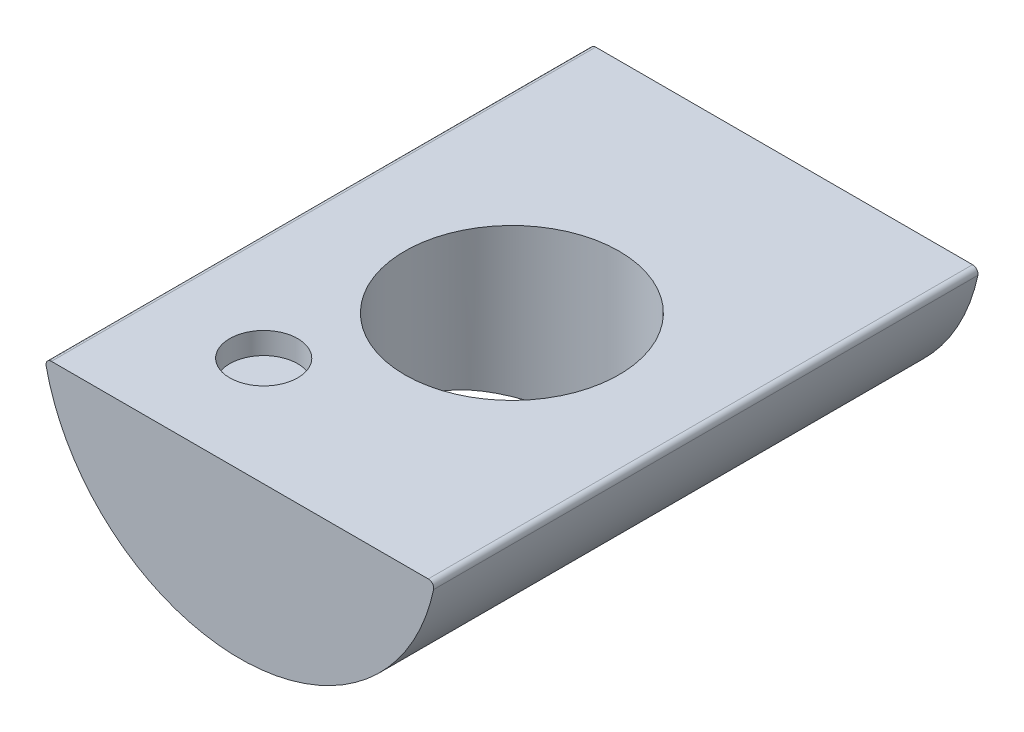
ISO-10303-21;
HEADER;
FILE_DESCRIPTION(('STEP AP214'),'2;1');
FILE_NAME('part.step','',(''),(''),'','','');
FILE_SCHEMA(('AUTOMOTIVE_DESIGN { 1 0 10303 214 1 1 1 1 }'));
ENDSEC;
DATA;
#1=APPLICATION_CONTEXT('core data for automotive mechanical design processes');
#2=APPLICATION_PROTOCOL_DEFINITION('international standard','automotive_design',2000,#1);
#3=PRODUCT_CONTEXT('',#1,'mechanical');
#4=PRODUCT('Part','Part','',(#3));
#5=PRODUCT_RELATED_PRODUCT_CATEGORY('part','',(#4));
#6=PRODUCT_DEFINITION_FORMATION('','',#4);
#7=PRODUCT_DEFINITION_CONTEXT('part definition',#1,'design');
#8=PRODUCT_DEFINITION('design','',#6,#7);
#9=PRODUCT_DEFINITION_SHAPE('','',#8);
#10=(LENGTH_UNIT() NAMED_UNIT(*) SI_UNIT(.MILLI.,.METRE.));
#11=(NAMED_UNIT(*) PLANE_ANGLE_UNIT() SI_UNIT($,.RADIAN.));
#12=(NAMED_UNIT(*) SI_UNIT($,.STERADIAN.) SOLID_ANGLE_UNIT());
#13=UNCERTAINTY_MEASURE_WITH_UNIT(LENGTH_MEASURE(1.E-05),#10,'distance_accuracy_value','');
#14=(GEOMETRIC_REPRESENTATION_CONTEXT(3) GLOBAL_UNCERTAINTY_ASSIGNED_CONTEXT((#13)) GLOBAL_UNIT_ASSIGNED_CONTEXT((#10,
#11,#12)) REPRESENTATION_CONTEXT('',''));
#15=CARTESIAN_POINT('',(0.,0.,0.));
#16=DIRECTION('',(0.,0.,1.));
#17=DIRECTION('',(1.,0.,0.));
#18=AXIS2_PLACEMENT_3D('',#15,#16,#17);
#19=CARTESIAN_POINT('',(-12.6225970548717,28.9487457233982,-4.81014496005846));
#20=DIRECTION('',(0.,0.,-1.));
#21=DIRECTION('',(-1.,0.,0.));
#22=AXIS2_PLACEMENT_3D('',#19,#20,#21);
#23=CYLINDRICAL_SURFACE('',#22,4.6228);
#24=CARTESIAN_POINT('',(-12.6248721884304,24.3259462832573,-8.66014496005847));
#25=CARTESIAN_POINT('',(-12.4947833335061,24.3258910699192,-8.66015506258581));
#26=CARTESIAN_POINT('',(-12.3645705771466,24.3313664831415,-8.67035875268396));
#27=CARTESIAN_POINT('',(-12.1080742805041,24.3528580509267,-8.71068866632045));
#28=CARTESIAN_POINT('',(-11.9817967768037,24.3688896379145,-8.74084405823269));
#29=CARTESIAN_POINT('',(-11.7372503259711,24.409830242305,-8.8195124474552));
#30=CARTESIAN_POINT('',(-11.6189510357819,24.4347030693686,-8.86795065597358));
#31=CARTESIAN_POINT('',(-11.3923804420316,24.4911119954172,-8.98137653848952));
#32=CARTESIAN_POINT('',(-11.2841093673319,24.5226482464192,-9.04636459005685));
#33=CARTESIAN_POINT('',(-11.0724886317545,24.5920654983948,-9.19596314164286));
#34=CARTESIAN_POINT('',(-10.9699584489724,24.6302304348879,-9.28159869626917));
#35=CARTESIAN_POINT('',(-10.779939603171,24.7078203252628,-9.46782638069024));
#36=CARTESIAN_POINT('',(-10.6924644748606,24.7472463755391,-9.56843181870825));
#37=CARTESIAN_POINT('',(-10.5267104926649,24.8272433993524,-9.79302877983199));
#38=CARTESIAN_POINT('',(-10.4500799810934,24.8675709444675,-9.91833153615035));
#39=CARTESIAN_POINT('',(-10.3192659632523,24.9399327099672,-10.182492226038));
#40=CARTESIAN_POINT('',(-10.2650650026226,24.971973371778,-10.3213395150658));
#41=CARTESIAN_POINT('',(-10.2039846131104,25.009062953147,-10.5322551124396));
#42=CARTESIAN_POINT('',(-10.1872560983136,25.0194129577074,-10.6006643838788));
#43=CARTESIAN_POINT('',(-10.1595835514487,25.0366983207679,-10.739051597819));
#44=CARTESIAN_POINT('',(-10.1486361807957,25.0436356499142,-10.8090286105614));
#45=CARTESIAN_POINT('',(-10.1327242028725,25.0537613040664,-10.9498697338461));
#46=CARTESIAN_POINT('',(-10.1277543402649,25.0569529221866,-11.0207330097243));
#47=CARTESIAN_POINT('',(-10.1238641924337,25.0594510476663,-11.1626699349994));
#48=CARTESIAN_POINT('',(-10.1249431346683,25.0587580511612,-11.2337435563725));
#49=CARTESIAN_POINT('',(-10.1360580874041,25.051629501079,-11.4255523821007));
#50=CARTESIAN_POINT('',(-10.1518868982212,25.0414806985369,-11.5458759320985));
#51=CARTESIAN_POINT('',(-10.2003727243255,25.0112474332418,-11.7817089395269));
#52=CARTESIAN_POINT('',(-10.2330368743097,24.9911587581859,-11.8972163334541));
#53=CARTESIAN_POINT('',(-10.3147177494191,24.9429676875543,-12.1234556720692));
#54=CARTESIAN_POINT('',(-10.364078281137,24.9146987802613,-12.2340267442154));
#55=CARTESIAN_POINT('',(-10.4774659879836,24.8532793084971,-12.4458758194738));
#56=CARTESIAN_POINT('',(-10.5414995998171,24.8201266039153,-12.5471497167641));
#57=CARTESIAN_POINT('',(-10.6936816093927,24.7466353626982,-12.7536782685087));
#58=CARTESIAN_POINT('',(-10.7840133048761,24.7059688734669,-12.857213676463));
#59=CARTESIAN_POINT('',(-10.9807518072106,24.6260258930419,-13.0484520310651));
#60=CARTESIAN_POINT('',(-11.087168834345,24.5867503053222,-13.1361448333278));
#61=CARTESIAN_POINT('',(-11.321381156863,24.5110466892464,-13.2984721090126));
#62=CARTESIAN_POINT('',(-11.4500976791397,24.4749508008773,-13.3719455732565));
#63=CARTESIAN_POINT('',(-11.7204915537697,24.4127052377438,-13.4955538186259));
#64=CARTESIAN_POINT('',(-11.8621569163935,24.3865464753404,-13.545709933232));
#65=CARTESIAN_POINT('',(-12.1405801131125,24.3491984927634,-13.6166003322927));
#66=CARTESIAN_POINT('',(-12.2766036298499,24.336859877629,-13.6396041894614));
#67=CARTESIAN_POINT('',(-12.5511089981064,24.3244619830764,-13.6628428176674));
#68=CARTESIAN_POINT('',(-12.6895893168498,24.3243952993073,-13.6630913182538));
#69=CARTESIAN_POINT('',(-12.9512205883297,24.3359556709932,-13.6418980287714));
#70=CARTESIAN_POINT('',(-13.0745926595186,24.3464882370768,-13.6224852725976));
#71=CARTESIAN_POINT('',(-13.3160176245164,24.3766290539829,-13.5659074589665));
#72=CARTESIAN_POINT('',(-13.4340699673564,24.3962382425195,-13.5287405673009));
#73=CARTESIAN_POINT('',(-13.6648810849621,24.4433995366948,-13.4370249909311));
#74=CARTESIAN_POINT('',(-13.7774441032006,24.4711314323756,-13.382079537852));
#75=CARTESIAN_POINT('',(-13.9920620713702,24.5320377819746,-13.2568676383551));
#76=CARTESIAN_POINT('',(-14.0941130075832,24.5652143023113,-13.1865953715506));
#77=CARTESIAN_POINT('',(-14.2967334099416,24.6382495762324,-13.0238951777197));
#78=CARTESIAN_POINT('',(-14.3959110692637,24.6784420915146,-12.9298820992575));
#79=CARTESIAN_POINT('',(-14.5778165395144,24.7586027156539,-12.7268653622545));
#80=CARTESIAN_POINT('',(-14.6605282098001,24.7985705673655,-12.6178471703656));
#81=CARTESIAN_POINT('',(-14.8129537234625,24.8768325171421,-12.3782859260122));
#82=CARTESIAN_POINT('',(-14.8813053569873,24.9147996305553,-12.2467587990439));
#83=CARTESIAN_POINT('',(-14.9942232114581,24.9801221035402,-11.9714565181079));
#84=CARTESIAN_POINT('',(-15.0388238626246,25.0074928082097,-11.8276994458731));
#85=CARTESIAN_POINT('',(-15.0985263682792,25.0447493355647,-11.5468813987647));
#86=CARTESIAN_POINT('',(-15.1160896094714,25.0560851365202,-11.410543659045));
#87=CARTESIAN_POINT('',(-15.1285127402432,25.0640650823522,-11.136448456777));
#88=CARTESIAN_POINT('',(-15.1233898166308,25.0607203490693,-10.9986921478354));
#89=CARTESIAN_POINT('',(-15.0929673649634,25.04134441439,-10.7444912877062));
#90=CARTESIAN_POINT('',(-15.0703390186203,25.0269948068469,-10.6275788518086));
#91=CARTESIAN_POINT('',(-15.0092571262486,24.9895273901035,-10.3994470179053));
#92=CARTESIAN_POINT('',(-14.9707974451508,24.966406181944,-10.288229845776));
#93=CARTESIAN_POINT('',(-14.8765106100756,24.9122527034785,-10.0667448284315));
#94=CARTESIAN_POINT('',(-14.8197383051975,24.8808123495136,-9.9569825826248));
#95=CARTESIAN_POINT('',(-14.6913615450978,24.8140473504262,-9.74780555991202));
#96=CARTESIAN_POINT('',(-14.6197491309074,24.7787206257751,-9.6483963786706));
#97=CARTESIAN_POINT('',(-14.4511578118419,24.701811597271,-9.44713769989663));
#98=CARTESIAN_POINT('',(-14.3519836923372,24.6600875261351,-9.34716967747395));
#99=CARTESIAN_POINT('',(-14.1374999176341,24.5797076317245,-9.16469671907208));
#100=CARTESIAN_POINT('',(-14.02217937607,24.5410539063516,-9.08220366028777));
#101=CARTESIAN_POINT('',(-13.7738934260775,24.4696976528702,-8.93503799707327));
#102=CARTESIAN_POINT('',(-13.6405127692056,24.4372006153006,-8.87095266061559));
#103=CARTESIAN_POINT('',(-13.4323572907515,24.396867275537,-8.79297920328528));
#104=CARTESIAN_POINT('',(-13.3616687489165,24.3848294860744,-8.77002200073376));
#105=CARTESIAN_POINT('',(-13.2181084495085,24.3638911495169,-8.73041183177));
#106=CARTESIAN_POINT('',(-13.1452378959059,24.3549889057088,-8.71375545547858));
#107=CARTESIAN_POINT('',(-12.9981696673681,24.3406368606036,-8.68704606058953));
#108=CARTESIAN_POINT('',(-12.9239762553925,24.3351775099125,-8.67697477434608));
#109=CARTESIAN_POINT('',(-12.774826353109,24.3278481326132,-8.66352130418447));
#110=CARTESIAN_POINT('',(-12.699869861025,24.3259781143612,-8.66013913583903));
#111=CARTESIAN_POINT('',(-12.6248721884304,24.3259462832573,-8.66014496005847));
#112=B_SPLINE_CURVE_WITH_KNOTS('',3,(#24,#25,#26,#27,#28,#29,#30,#31,#32,#33,#34,#35,#36,#37,
#38,#39,#40,#41,#42,#43,#44,#45,#46,#47,#48,#49,#50,#51,#52,#53,#54,#55,#56,#57,#58,#59,#60,#61,
#62,#63,#64,#65,#66,#67,#68,#69,#70,#71,#72,#73,#74,#75,#76,#77,#78,#79,#80,#81,#82,#83,#84,#85,
#86,#87,#88,#89,#90,#91,#92,#93,#94,#95,#96,#97,#98,#99,#100,#101,#102,#103,#104,#105,#106,#107,
#108,#109,#110,#111),.UNSPECIFIED.,.T.,.F.,(4,2,2,2,2,2,2,2,2,2,2,2,2,2,2,2,2,2,2,2,2,2,2,2,2,2,
2,2,2,2,2,2,2,2,2,2,2,2,2,2,2,2,2,4),(0.,0.389975669646753,0.780522727396523,1.1694892061093,
1.5584645595374,1.9735755456586,2.38905779489529,2.84377274402692,3.29813317194911,
3.51140204067258,3.7245476125161,3.93750565259702,4.15043649470088,4.51389400564802,
4.87750567411165,5.2491133714723,5.6208843967549,6.04894903486926,6.47728680856016,
6.93243693641296,7.3871698153452,7.80035313922949,8.21328716540975,8.58755149201617,
8.96185449283524,9.34516508991348,9.72862150415492,10.1541623494313,10.5801182954394,
11.0367018261548,11.4926216637877,11.9038866293004,12.314840077976,12.6731027058884,
13.0315043011279,13.4125896657364,13.7938799434433,14.2325141558935,14.6714455447145,
15.1231272629386,15.3487024158762,15.5741553168811,15.7989801069811,16.0238054204875),.UNSPECIFIED.);
#113=CARTESIAN_POINT('',(-12.6248721884304,24.3259462832573,-8.66014496005847));
#114=VERTEX_POINT('',#113);
#115=EDGE_CURVE('E20',#114,#114,#112,.T.);
#116=ORIENTED_EDGE('',*,*,#115,.T.);
#117=EDGE_LOOP('',(#116));
#118=FACE_BOUND('',#117,.T.);
#119=CARTESIAN_POINT('',(-12.6225970548717,28.9487457233982,-17.5101449600585));
#120=DIRECTION('',(0.,0.,1.));
#121=DIRECTION('',(1.,0.,0.));
#122=AXIS2_PLACEMENT_3D('',#119,#120,#121);
#123=CIRCLE('',#122,4.6228);
#124=CARTESIAN_POINT('',(-17.1432664012428,27.9823977007994,-17.5101449600585));
#125=VERTEX_POINT('',#124);
#126=CARTESIAN_POINT('',(-8.10192770850058,27.9823977007994,-17.5101449600585));
#127=VERTEX_POINT('',#126);
#128=EDGE_CURVE('E85',#125,#127,#123,.T.);
#129=ORIENTED_EDGE('',*,*,#128,.T.);
#130=DIRECTION('',(0.,0.,-1.));
#131=VECTOR('',#130,1.);
#132=CARTESIAN_POINT('',(-8.10192770850058,27.9823977007994,-4.81014496005846));
#133=LINE('',#132,#131);
#134=CARTESIAN_POINT('',(-8.10192770850058,27.9823977007994,-4.81014496005846));
#135=VERTEX_POINT('',#134);
#136=EDGE_CURVE('E10',#135,#127,#133,.T.);
#137=ORIENTED_EDGE('',*,*,#136,.F.);
#138=CARTESIAN_POINT('',(-12.6225970548717,28.9487457233982,-4.81014496005846));
#139=DIRECTION('',(0.,0.,1.));
#140=DIRECTION('',(1.,0.,0.));
#141=AXIS2_PLACEMENT_3D('',#138,#139,#140);
#142=CIRCLE('',#141,4.6228);
#143=CARTESIAN_POINT('',(-17.1432664012428,27.9823977007994,-4.81014496005846));
#144=VERTEX_POINT('',#143);
#145=EDGE_CURVE('E72',#144,#135,#142,.T.);
#146=ORIENTED_EDGE('',*,*,#145,.F.);
#147=DIRECTION('',(0.,0.,-1.));
#148=VECTOR('',#147,1.);
#149=CARTESIAN_POINT('',(-17.1432664012428,27.9823977007994,-4.81014496005846));
#150=LINE('',#149,#148);
#151=EDGE_CURVE('E81',#144,#125,#150,.T.);
#152=ORIENTED_EDGE('',*,*,#151,.T.);
#153=EDGE_LOOP('',(#129,#137,#146,#152));
#154=FACE_BOUND('',#153,.T.);
#155=ADVANCED_FACE('F16',(#118,#154),#23,.T.);
#156=CARTESIAN_POINT('',(-8.22612192131297,28.0089457233982,-4.81014496005846));
#157=DIRECTION('',(0.,0.,-1.));
#158=DIRECTION('',(-1.,0.,0.));
#159=AXIS2_PLACEMENT_3D('',#156,#157,#158);
#160=CYLINDRICAL_SURFACE('',#159,0.126999999999999);
#161=CARTESIAN_POINT('',(-8.22612192131297,28.0089457233982,-17.5101449600585));
#162=DIRECTION('',(0.,0.,1.));
#163=DIRECTION('',(1.,0.,0.));
#164=AXIS2_PLACEMENT_3D('',#161,#162,#163);
#165=CIRCLE('',#164,0.126999999999999);
#166=CARTESIAN_POINT('',(-8.22612192131297,28.1359457233982,-17.5101449600585));
#167=VERTEX_POINT('',#166);
#168=EDGE_CURVE('E76',#127,#167,#165,.T.);
#169=ORIENTED_EDGE('',*,*,#168,.T.);
#170=DIRECTION('',(0.,0.,-1.));
#171=VECTOR('',#170,1.);
#172=CARTESIAN_POINT('',(-8.22612192131297,28.1359457233982,-4.81014496005846));
#173=LINE('',#172,#171);
#174=CARTESIAN_POINT('',(-8.22612192131297,28.1359457233982,-4.81014496005846));
#175=VERTEX_POINT('',#174);
#176=EDGE_CURVE('E29',#175,#167,#173,.T.);
#177=ORIENTED_EDGE('',*,*,#176,.F.);
#178=CARTESIAN_POINT('',(-8.22612192131297,28.0089457233982,-4.81014496005846));
#179=DIRECTION('',(0.,0.,1.));
#180=DIRECTION('',(1.,0.,0.));
#181=AXIS2_PLACEMENT_3D('',#178,#179,#180);
#182=CIRCLE('',#181,0.126999999999999);
#183=EDGE_CURVE('E67',#135,#175,#182,.T.);
#184=ORIENTED_EDGE('',*,*,#183,.F.);
#185=ORIENTED_EDGE('',*,*,#136,.T.);
#186=EDGE_LOOP('',(#169,#177,#184,#185));
#187=FACE_BOUND('',#186,.T.);
#188=ADVANCED_FACE('F75',(#187),#160,.T.);
#189=CARTESIAN_POINT('',(-8.22612192131297,28.1359457233982,-4.81014496005846));
#190=DIRECTION('',(0.,-1.,0.));
#191=DIRECTION('',(1.,0.,0.));
#192=AXIS2_PLACEMENT_3D('',#189,#190,#191);
#193=PLANE('',#192);
#194=CARTESIAN_POINT('',(-14.6060721884304,28.1359457233982,-7.35014496005846));
#195=DIRECTION('',(0.,1.,0.));
#196=DIRECTION('',(0.,0.,1.));
#197=AXIS2_PLACEMENT_3D('',#194,#195,#196);
#198=CIRCLE('',#197,0.79375);
#199=CARTESIAN_POINT('',(-14.6060721884304,28.1359457233982,-6.55639496005846));
#200=VERTEX_POINT('',#199);
#201=EDGE_CURVE('E104',#200,#200,#198,.T.);
#202=ORIENTED_EDGE('',*,*,#201,.F.);
#203=EDGE_LOOP('',(#202));
#204=FACE_BOUND('',#203,.T.);
#205=CARTESIAN_POINT('',(-12.6248721884304,28.1359457233982,-11.1601449600585));
#206=DIRECTION('',(0.,1.,0.));
#207=DIRECTION('',(0.,0.,1.));
#208=AXIS2_PLACEMENT_3D('',#205,#206,#207);
#209=CIRCLE('',#208,2.49999999999999);
#210=CARTESIAN_POINT('',(-12.6248721884304,28.1359457233982,-8.66014496005847));
#211=VERTEX_POINT('',#210);
#212=EDGE_CURVE('E98',#211,#211,#209,.T.);
#213=ORIENTED_EDGE('',*,*,#212,.F.);
#214=EDGE_LOOP('',(#213));
#215=FACE_BOUND('',#214,.T.);
#216=DIRECTION('',(-1.,0.,0.));
#217=VECTOR('',#216,1.);
#218=CARTESIAN_POINT('',(-8.22612192131297,28.1359457233982,-17.5101449600585));
#219=LINE('',#218,#217);
#220=CARTESIAN_POINT('',(-17.0190721884304,28.1359457233982,-17.5101449600585));
#221=VERTEX_POINT('',#220);
#222=EDGE_CURVE('E54',#167,#221,#219,.T.);
#223=ORIENTED_EDGE('',*,*,#222,.T.);
#224=DIRECTION('',(0.,0.,-1.));
#225=VECTOR('',#224,1.);
#226=CARTESIAN_POINT('',(-17.0190721884304,28.1359457233982,-4.81014496005846));
#227=LINE('',#226,#225);
#228=CARTESIAN_POINT('',(-17.0190721884304,28.1359457233982,-4.81014496005846));
#229=VERTEX_POINT('',#228);
#230=EDGE_CURVE('E77',#229,#221,#227,.T.);
#231=ORIENTED_EDGE('',*,*,#230,.F.);
#232=DIRECTION('',(-1.,0.,0.));
#233=VECTOR('',#232,1.);
#234=CARTESIAN_POINT('',(-8.22612192131297,28.1359457233982,-4.81014496005846));
#235=LINE('',#234,#233);
#236=EDGE_CURVE('E70',#175,#229,#235,.T.);
#237=ORIENTED_EDGE('',*,*,#236,.F.);
#238=ORIENTED_EDGE('',*,*,#176,.T.);
#239=EDGE_LOOP('',(#223,#231,#237,#238));
#240=FACE_BOUND('',#239,.T.);
#241=ADVANCED_FACE('F79',(#204,#215,#240),#193,.F.);
#242=CARTESIAN_POINT('',(-17.0190721884304,28.0089457233982,-4.81014496005846));
#243=DIRECTION('',(0.,0.,-1.));
#244=DIRECTION('',(-1.,0.,0.));
#245=AXIS2_PLACEMENT_3D('',#242,#243,#244);
#246=CYLINDRICAL_SURFACE('',#245,0.127);
#247=CARTESIAN_POINT('',(-17.0190721884304,28.0089457233982,-17.5101449600585));
#248=DIRECTION('',(0.,0.,1.));
#249=DIRECTION('',(1.,0.,0.));
#250=AXIS2_PLACEMENT_3D('',#247,#248,#249);
#251=CIRCLE('',#250,0.127);
#252=EDGE_CURVE('E60',#221,#125,#251,.T.);
#253=ORIENTED_EDGE('',*,*,#252,.T.);
#254=ORIENTED_EDGE('',*,*,#151,.F.);
#255=CARTESIAN_POINT('',(-17.0190721884304,28.0089457233982,-4.81014496005846));
#256=DIRECTION('',(0.,0.,1.));
#257=DIRECTION('',(1.,0.,0.));
#258=AXIS2_PLACEMENT_3D('',#255,#256,#257);
#259=CIRCLE('',#258,0.127);
#260=EDGE_CURVE('E37',#229,#144,#259,.T.);
#261=ORIENTED_EDGE('',*,*,#260,.F.);
#262=ORIENTED_EDGE('',*,*,#230,.T.);
#263=EDGE_LOOP('',(#253,#254,#261,#262));
#264=FACE_BOUND('',#263,.T.);
#265=ADVANCED_FACE('F92',(#264),#246,.T.);
#266=CARTESIAN_POINT('',(-12.6225970548717,28.9487457233982,-4.81014496005846));
#267=DIRECTION('',(0.,0.,1.));
#268=DIRECTION('',(1.,0.,0.));
#269=AXIS2_PLACEMENT_3D('',#266,#267,#268);
#270=PLANE('',#269);
#271=ORIENTED_EDGE('',*,*,#145,.T.);
#272=ORIENTED_EDGE('',*,*,#183,.T.);
#273=ORIENTED_EDGE('',*,*,#236,.T.);
#274=ORIENTED_EDGE('',*,*,#260,.T.);
#275=EDGE_LOOP('',(#271,#272,#273,#274));
#276=FACE_BOUND('',#275,.T.);
#277=ADVANCED_FACE('F68',(#276),#270,.T.);
#278=CARTESIAN_POINT('',(-12.6225970548717,28.9487457233982,-17.5101449600585));
#279=DIRECTION('',(0.,0.,1.));
#280=DIRECTION('',(1.,0.,0.));
#281=AXIS2_PLACEMENT_3D('',#278,#279,#280);
#282=PLANE('',#281);
#283=ORIENTED_EDGE('',*,*,#128,.F.);
#284=ORIENTED_EDGE('',*,*,#252,.F.);
#285=ORIENTED_EDGE('',*,*,#222,.F.);
#286=ORIENTED_EDGE('',*,*,#168,.F.);
#287=EDGE_LOOP('',(#283,#284,#285,#286));
#288=FACE_BOUND('',#287,.T.);
#289=ADVANCED_FACE('F95',(#288),#282,.F.);
#290=CARTESIAN_POINT('',(-12.6248721884304,28.1359457233982,-11.1601449600585));
#291=DIRECTION('',(0.,1.,0.));
#292=DIRECTION('',(0.,0.,1.));
#293=AXIS2_PLACEMENT_3D('',#290,#291,#292);
#294=CYLINDRICAL_SURFACE('',#293,2.49999999999999);
#295=ORIENTED_EDGE('',*,*,#212,.T.);
#296=EDGE_LOOP('',(#295));
#297=FACE_BOUND('',#296,.T.);
#298=ORIENTED_EDGE('',*,*,#115,.F.);
#299=EDGE_LOOP('',(#298));
#300=FACE_BOUND('',#299,.T.);
#301=ADVANCED_FACE('F115',(#297,#300),#294,.F.);
#302=CARTESIAN_POINT('',(-14.6060721884304,27.6279457233982,-7.35014496005846));
#303=DIRECTION('',(0.,-1.,0.));
#304=DIRECTION('',(0.,0.,-1.));
#305=AXIS2_PLACEMENT_3D('',#302,#303,#304);
#306=PLANE('',#305);
#307=CARTESIAN_POINT('',(-14.6060721884304,27.6279457233982,-7.35014496005846));
#308=DIRECTION('',(0.,1.,0.));
#309=DIRECTION('',(0.,0.,1.));
#310=AXIS2_PLACEMENT_3D('',#307,#308,#309);
#311=CIRCLE('',#310,0.79375);
#312=CARTESIAN_POINT('',(-14.6060721884304,27.6279457233982,-6.55639496005846));
#313=VERTEX_POINT('',#312);
#314=EDGE_CURVE('E101',#313,#313,#311,.T.);
#315=ORIENTED_EDGE('',*,*,#314,.T.);
#316=EDGE_LOOP('',(#315));
#317=FACE_BOUND('',#316,.T.);
#318=ADVANCED_FACE('F118',(#317),#306,.F.);
#319=CARTESIAN_POINT('',(-14.6060721884304,28.1359457233982,-7.35014496005846));
#320=DIRECTION('',(0.,1.,0.));
#321=DIRECTION('',(0.,0.,1.));
#322=AXIS2_PLACEMENT_3D('',#319,#320,#321);
#323=CYLINDRICAL_SURFACE('',#322,0.79375);
#324=ORIENTED_EDGE('',*,*,#314,.F.);
#325=EDGE_LOOP('',(#324));
#326=FACE_BOUND('',#325,.T.);
#327=ORIENTED_EDGE('',*,*,#201,.T.);
#328=EDGE_LOOP('',(#327));
#329=FACE_BOUND('',#328,.T.);
#330=ADVANCED_FACE('F108',(#326,#329),#323,.F.);
#331=CLOSED_SHELL('',(#155,#188,#241,#265,#277,#289,#301,#318,#330));
#332=MANIFOLD_SOLID_BREP('B1',#331);
#333=ADVANCED_BREP_SHAPE_REPRESENTATION('',(#18,#332),#14);
#334=SHAPE_DEFINITION_REPRESENTATION(#9,#333);
ENDSEC;
END-ISO-10303-21;
